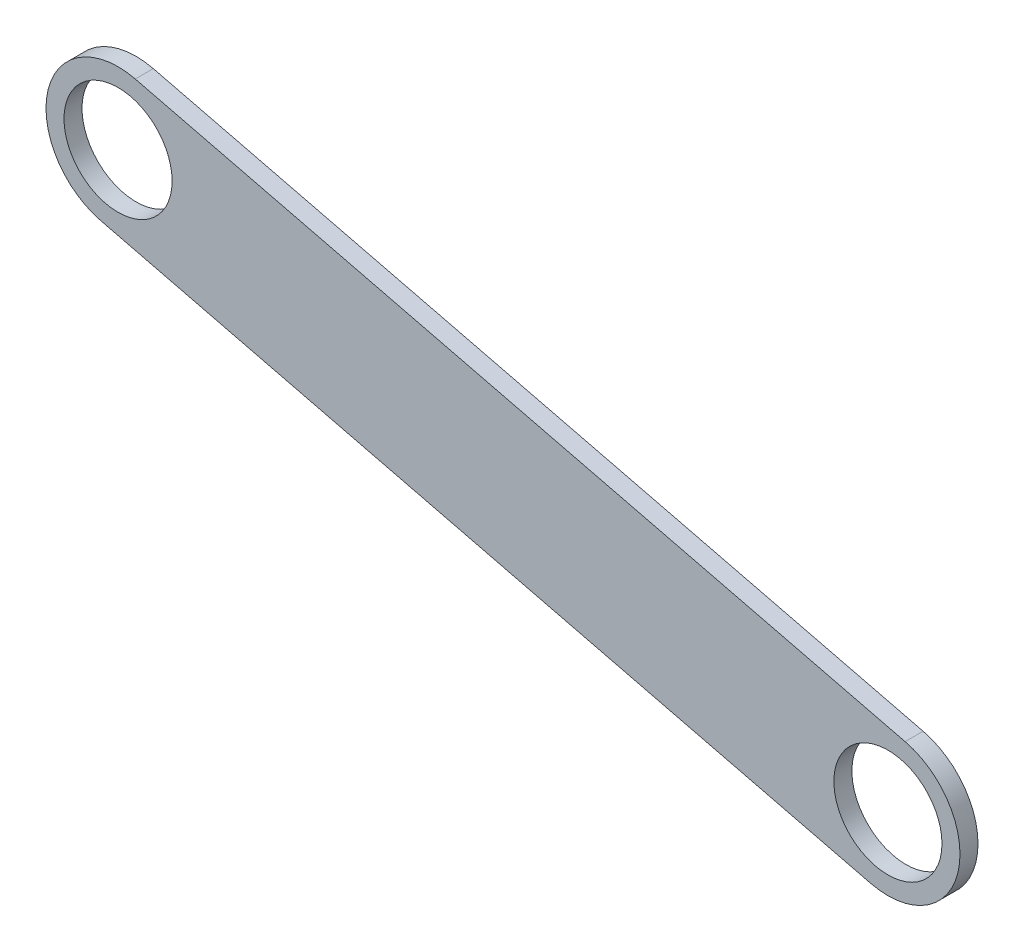
ISO-10303-21;
HEADER;
FILE_DESCRIPTION(('STEP AP214'),'2;1');
FILE_NAME('part.step','',(''),(''),'','','');
FILE_SCHEMA(('AUTOMOTIVE_DESIGN { 1 0 10303 214 1 1 1 1 }'));
ENDSEC;
DATA;
#1=APPLICATION_CONTEXT('core data for automotive mechanical design processes');
#2=APPLICATION_PROTOCOL_DEFINITION('international standard','automotive_design',2000,#1);
#3=PRODUCT_CONTEXT('',#1,'mechanical');
#4=PRODUCT('Part','Part','',(#3));
#5=PRODUCT_RELATED_PRODUCT_CATEGORY('part','',(#4));
#6=PRODUCT_DEFINITION_FORMATION('','',#4);
#7=PRODUCT_DEFINITION_CONTEXT('part definition',#1,'design');
#8=PRODUCT_DEFINITION('design','',#6,#7);
#9=PRODUCT_DEFINITION_SHAPE('','',#8);
#10=(LENGTH_UNIT() NAMED_UNIT(*) SI_UNIT(.MILLI.,.METRE.));
#11=(NAMED_UNIT(*) PLANE_ANGLE_UNIT() SI_UNIT($,.RADIAN.));
#12=(NAMED_UNIT(*) SI_UNIT($,.STERADIAN.) SOLID_ANGLE_UNIT());
#13=UNCERTAINTY_MEASURE_WITH_UNIT(LENGTH_MEASURE(1.E-05),#10,'distance_accuracy_value','');
#14=(GEOMETRIC_REPRESENTATION_CONTEXT(3) GLOBAL_UNCERTAINTY_ASSIGNED_CONTEXT((#13)) GLOBAL_UNIT_ASSIGNED_CONTEXT((#10,
#11,#12)) REPRESENTATION_CONTEXT('',''));
#15=CARTESIAN_POINT('',(0.,0.,0.));
#16=DIRECTION('',(0.,0.,1.));
#17=DIRECTION('',(1.,0.,0.));
#18=AXIS2_PLACEMENT_3D('',#15,#16,#17);
#19=CARTESIAN_POINT('',(-49.8764652030516,15.4834753213218,-1.));
#20=DIRECTION('',(0.,0.,1.));
#21=DIRECTION('',(1.,0.,0.));
#22=AXIS2_PLACEMENT_3D('',#19,#20,#21);
#23=CYLINDRICAL_SURFACE('',#22,4.00000000000001);
#24=CARTESIAN_POINT('',(-49.8764652030516,15.4834753213218,0.));
#25=DIRECTION('',(0.,0.,1.));
#26=DIRECTION('',(1.,0.,0.));
#27=AXIS2_PLACEMENT_3D('',#24,#25,#26);
#28=CIRCLE('',#27,4.00000000000001);
#29=CARTESIAN_POINT('',(-48.9231517071657,19.3682138425819,0.));
#30=VERTEX_POINT('',#29);
#31=CARTESIAN_POINT('',(-50.8297786989375,11.5987368000618,0.));
#32=VERTEX_POINT('',#31);
#33=EDGE_CURVE('E106',#30,#32,#28,.T.);
#34=ORIENTED_EDGE('',*,*,#33,.F.);
#35=DIRECTION('',(0.,0.,1.));
#36=VECTOR('',#35,1.);
#37=CARTESIAN_POINT('',(-48.9231517071657,19.3682138425819,-1.));
#38=LINE('',#37,#36);
#39=CARTESIAN_POINT('',(-48.9231517071657,19.3682138425819,-1.));
#40=VERTEX_POINT('',#39);
#41=EDGE_CURVE('E11',#40,#30,#38,.T.);
#42=ORIENTED_EDGE('',*,*,#41,.F.);
#43=CARTESIAN_POINT('',(-49.8764652030516,15.4834753213218,-1.));
#44=DIRECTION('',(0.,0.,1.));
#45=DIRECTION('',(1.,0.,0.));
#46=AXIS2_PLACEMENT_3D('',#43,#44,#45);
#47=CIRCLE('',#46,4.00000000000001);
#48=CARTESIAN_POINT('',(-50.8297786989375,11.5987368000618,-1.));
#49=VERTEX_POINT('',#48);
#50=EDGE_CURVE('E99',#40,#49,#47,.T.);
#51=ORIENTED_EDGE('',*,*,#50,.T.);
#52=DIRECTION('',(0.,0.,1.));
#53=VECTOR('',#52,1.);
#54=CARTESIAN_POINT('',(-50.8297786989375,11.5987368000618,-1.));
#55=LINE('',#54,#53);
#56=EDGE_CURVE('E44',#49,#32,#55,.T.);
#57=ORIENTED_EDGE('',*,*,#56,.T.);
#58=EDGE_LOOP('',(#34,#42,#51,#57));
#59=FACE_BOUND('',#58,.T.);
#60=ADVANCED_FACE('F41',(#59),#23,.T.);
#61=CARTESIAN_POINT('',(-48.9231517071657,19.3682138425819,-1.));
#62=DIRECTION('',(0.238328373971476,0.971184630315015,0.));
#63=DIRECTION('',(-0.971184630315015,0.238328373971476,0.));
#64=AXIS2_PLACEMENT_3D('',#61,#62,#63);
#65=PLANE('',#64);
#66=DIRECTION('',(-0.971184630315015,0.238328373971476,0.));
#67=VECTOR('',#66,1.);
#68=CARTESIAN_POINT('',(-48.9231517071657,19.3682138425819,0.));
#69=LINE('',#68,#67);
#70=CARTESIAN_POINT('',(-6.19102797330503,8.88176538783694,0.));
#71=VERTEX_POINT('',#70);
#72=EDGE_CURVE('E101',#71,#30,#69,.T.);
#73=ORIENTED_EDGE('',*,*,#72,.F.);
#74=DIRECTION('',(0.,0.,1.));
#75=VECTOR('',#74,1.);
#76=CARTESIAN_POINT('',(-6.19102797330503,8.88176538783694,-1.));
#77=LINE('',#76,#75);
#78=CARTESIAN_POINT('',(-6.19102797330503,8.88176538783694,-1.));
#79=VERTEX_POINT('',#78);
#80=EDGE_CURVE('E50',#79,#71,#77,.T.);
#81=ORIENTED_EDGE('',*,*,#80,.F.);
#82=DIRECTION('',(-0.971184630315015,0.238328373971476,0.));
#83=VECTOR('',#82,1.);
#84=CARTESIAN_POINT('',(-48.9231517071657,19.3682138425819,-1.));
#85=LINE('',#84,#83);
#86=EDGE_CURVE('E96',#79,#40,#85,.T.);
#87=ORIENTED_EDGE('',*,*,#86,.T.);
#88=ORIENTED_EDGE('',*,*,#41,.T.);
#89=EDGE_LOOP('',(#73,#81,#87,#88));
#90=FACE_BOUND('',#89,.T.);
#91=ADVANCED_FACE('F117',(#90),#65,.T.);
#92=CARTESIAN_POINT('',(-7.14434146919093,4.99702686657689,-1.));
#93=DIRECTION('',(0.,0.,1.));
#94=DIRECTION('',(1.,0.,0.));
#95=AXIS2_PLACEMENT_3D('',#92,#93,#94);
#96=CYLINDRICAL_SURFACE('',#95,4.);
#97=CARTESIAN_POINT('',(-7.14434146919093,4.99702686657689,0.));
#98=DIRECTION('',(0.,0.,1.));
#99=DIRECTION('',(1.,0.,0.));
#100=AXIS2_PLACEMENT_3D('',#97,#98,#99);
#101=CIRCLE('',#100,4.);
#102=CARTESIAN_POINT('',(-8.09765496507683,1.11228834531683,0.));
#103=VERTEX_POINT('',#102);
#104=EDGE_CURVE('E91',#103,#71,#101,.T.);
#105=ORIENTED_EDGE('',*,*,#104,.F.);
#106=DIRECTION('',(0.,0.,1.));
#107=VECTOR('',#106,1.);
#108=CARTESIAN_POINT('',(-8.09765496507683,1.11228834531683,-1.));
#109=LINE('',#108,#107);
#110=CARTESIAN_POINT('',(-8.09765496507683,1.11228834531683,-1.));
#111=VERTEX_POINT('',#110);
#112=EDGE_CURVE('E86',#111,#103,#109,.T.);
#113=ORIENTED_EDGE('',*,*,#112,.F.);
#114=CARTESIAN_POINT('',(-7.14434146919093,4.99702686657689,-1.));
#115=DIRECTION('',(0.,0.,1.));
#116=DIRECTION('',(1.,0.,0.));
#117=AXIS2_PLACEMENT_3D('',#114,#115,#116);
#118=CIRCLE('',#117,4.);
#119=EDGE_CURVE('E89',#111,#79,#118,.T.);
#120=ORIENTED_EDGE('',*,*,#119,.T.);
#121=ORIENTED_EDGE('',*,*,#80,.T.);
#122=EDGE_LOOP('',(#105,#113,#120,#121));
#123=FACE_BOUND('',#122,.T.);
#124=ADVANCED_FACE('F88',(#123),#96,.T.);
#125=CARTESIAN_POINT('',(-50.8297786989375,11.5987368000618,-1.));
#126=DIRECTION('',(-0.238328373971476,-0.971184630315015,0.));
#127=DIRECTION('',(0.971184630315015,-0.238328373971476,0.));
#128=AXIS2_PLACEMENT_3D('',#125,#126,#127);
#129=PLANE('',#128);
#130=DIRECTION('',(0.971184630315015,-0.238328373971476,0.));
#131=VECTOR('',#130,1.);
#132=CARTESIAN_POINT('',(-50.8297786989375,11.5987368000618,0.));
#133=LINE('',#132,#131);
#134=EDGE_CURVE('E109',#32,#103,#133,.T.);
#135=ORIENTED_EDGE('',*,*,#134,.F.);
#136=ORIENTED_EDGE('',*,*,#56,.F.);
#137=DIRECTION('',(0.971184630315015,-0.238328373971476,0.));
#138=VECTOR('',#137,1.);
#139=CARTESIAN_POINT('',(-50.8297786989375,11.5987368000618,-1.));
#140=LINE('',#139,#138);
#141=EDGE_CURVE('E95',#49,#111,#140,.T.);
#142=ORIENTED_EDGE('',*,*,#141,.T.);
#143=ORIENTED_EDGE('',*,*,#112,.T.);
#144=EDGE_LOOP('',(#135,#136,#142,#143));
#145=FACE_BOUND('',#144,.T.);
#146=ADVANCED_FACE('F98',(#145),#129,.T.);
#147=CARTESIAN_POINT('',(-49.8764652030516,15.4834753213218,-1.));
#148=DIRECTION('',(0.,0.,1.));
#149=DIRECTION('',(1.,0.,0.));
#150=AXIS2_PLACEMENT_3D('',#147,#148,#149);
#151=PLANE('',#150);
#152=CARTESIAN_POINT('',(-7.14434146919093,4.99702686657689,-1.));
#153=DIRECTION('',(0.,0.,1.));
#154=DIRECTION('',(1.,0.,0.));
#155=AXIS2_PLACEMENT_3D('',#152,#153,#154);
#156=CIRCLE('',#155,3.);
#157=CARTESIAN_POINT('',(-4.14434146919093,4.99702686657689,-1.));
#158=VERTEX_POINT('',#157);
#159=EDGE_CURVE('E150',#158,#158,#156,.T.);
#160=ORIENTED_EDGE('',*,*,#159,.T.);
#161=EDGE_LOOP('',(#160));
#162=FACE_BOUND('',#161,.T.);
#163=CARTESIAN_POINT('',(-49.8764652030516,15.4834753213218,-1.));
#164=DIRECTION('',(0.,0.,1.));
#165=DIRECTION('',(1.,0.,0.));
#166=AXIS2_PLACEMENT_3D('',#163,#164,#165);
#167=CIRCLE('',#166,3.);
#168=CARTESIAN_POINT('',(-46.8764652030516,15.4834753213218,-1.));
#169=VERTEX_POINT('',#168);
#170=EDGE_CURVE('E110',#169,#169,#167,.T.);
#171=ORIENTED_EDGE('',*,*,#170,.T.);
#172=EDGE_LOOP('',(#171));
#173=FACE_BOUND('',#172,.T.);
#174=ORIENTED_EDGE('',*,*,#50,.F.);
#175=ORIENTED_EDGE('',*,*,#86,.F.);
#176=ORIENTED_EDGE('',*,*,#119,.F.);
#177=ORIENTED_EDGE('',*,*,#141,.F.);
#178=EDGE_LOOP('',(#174,#175,#176,#177));
#179=FACE_BOUND('',#178,.T.);
#180=ADVANCED_FACE('F94',(#162,#173,#179),#151,.F.);
#181=CARTESIAN_POINT('',(-49.8764652030516,15.4834753213218,0.));
#182=DIRECTION('',(0.,0.,1.));
#183=DIRECTION('',(1.,0.,0.));
#184=AXIS2_PLACEMENT_3D('',#181,#182,#183);
#185=PLANE('',#184);
#186=CARTESIAN_POINT('',(-7.14434146919093,4.99702686657689,0.));
#187=DIRECTION('',(0.,0.,1.));
#188=DIRECTION('',(1.,0.,0.));
#189=AXIS2_PLACEMENT_3D('',#186,#187,#188);
#190=CIRCLE('',#189,3.);
#191=CARTESIAN_POINT('',(-4.14434146919093,4.99702686657689,0.));
#192=VERTEX_POINT('',#191);
#193=EDGE_CURVE('E153',#192,#192,#190,.T.);
#194=ORIENTED_EDGE('',*,*,#193,.F.);
#195=EDGE_LOOP('',(#194));
#196=FACE_BOUND('',#195,.T.);
#197=CARTESIAN_POINT('',(-49.8764652030516,15.4834753213218,0.));
#198=DIRECTION('',(0.,0.,1.));
#199=DIRECTION('',(1.,0.,0.));
#200=AXIS2_PLACEMENT_3D('',#197,#198,#199);
#201=CIRCLE('',#200,3.);
#202=CARTESIAN_POINT('',(-46.8764652030516,15.4834753213218,0.));
#203=VERTEX_POINT('',#202);
#204=EDGE_CURVE('E155',#203,#203,#201,.T.);
#205=ORIENTED_EDGE('',*,*,#204,.F.);
#206=EDGE_LOOP('',(#205));
#207=FACE_BOUND('',#206,.T.);
#208=ORIENTED_EDGE('',*,*,#33,.T.);
#209=ORIENTED_EDGE('',*,*,#134,.T.);
#210=ORIENTED_EDGE('',*,*,#104,.T.);
#211=ORIENTED_EDGE('',*,*,#72,.T.);
#212=EDGE_LOOP('',(#208,#209,#210,#211));
#213=FACE_BOUND('',#212,.T.);
#214=ADVANCED_FACE('F116',(#196,#207,#213),#185,.T.);
#215=CARTESIAN_POINT('',(-49.8764652030516,15.4834753213218,-1.));
#216=DIRECTION('',(0.,0.,1.));
#217=DIRECTION('',(1.,0.,0.));
#218=AXIS2_PLACEMENT_3D('',#215,#216,#217);
#219=CYLINDRICAL_SURFACE('',#218,3.);
#220=ORIENTED_EDGE('',*,*,#170,.F.);
#221=EDGE_LOOP('',(#220));
#222=FACE_BOUND('',#221,.T.);
#223=ORIENTED_EDGE('',*,*,#204,.T.);
#224=EDGE_LOOP('',(#223));
#225=FACE_BOUND('',#224,.T.);
#226=ADVANCED_FACE('F135',(#222,#225),#219,.F.);
#227=CARTESIAN_POINT('',(-7.14434146919093,4.99702686657689,-1.));
#228=DIRECTION('',(0.,0.,1.));
#229=DIRECTION('',(1.,0.,0.));
#230=AXIS2_PLACEMENT_3D('',#227,#228,#229);
#231=CYLINDRICAL_SURFACE('',#230,3.);
#232=ORIENTED_EDGE('',*,*,#159,.F.);
#233=EDGE_LOOP('',(#232));
#234=FACE_BOUND('',#233,.T.);
#235=ORIENTED_EDGE('',*,*,#193,.T.);
#236=EDGE_LOOP('',(#235));
#237=FACE_BOUND('',#236,.T.);
#238=ADVANCED_FACE('F142',(#234,#237),#231,.F.);
#239=CLOSED_SHELL('',(#60,#91,#124,#146,#180,#214,#226,#238));
#240=MANIFOLD_SOLID_BREP('B2',#239);
#241=ADVANCED_BREP_SHAPE_REPRESENTATION('',(#18,#240),#14);
#242=SHAPE_DEFINITION_REPRESENTATION(#9,#241);
ENDSEC;
END-ISO-10303-21;
